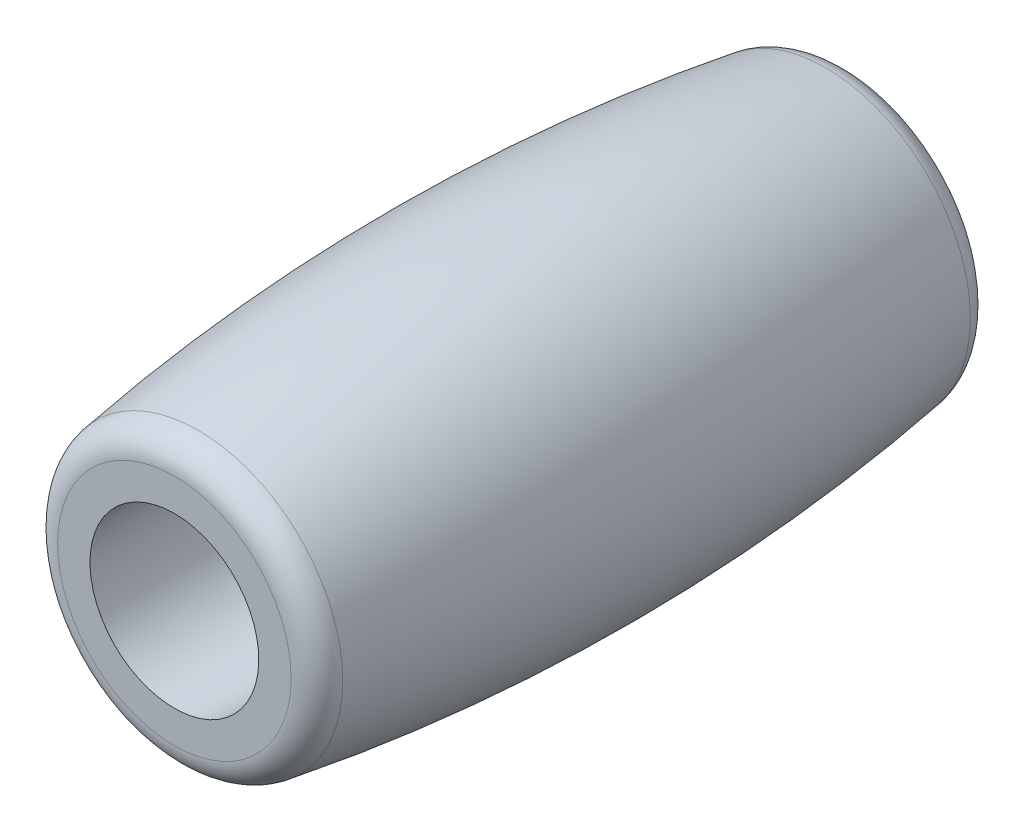
ISO-10303-21;
HEADER;
FILE_DESCRIPTION(('STEP AP214'),'2;1');
FILE_NAME('part.step','',(''),(''),'','','');
FILE_SCHEMA(('AUTOMOTIVE_DESIGN { 1 0 10303 214 1 1 1 1 }'));
ENDSEC;
DATA;
#1=APPLICATION_CONTEXT('core data for automotive mechanical design processes');
#2=APPLICATION_PROTOCOL_DEFINITION('international standard','automotive_design',2000,#1);
#3=PRODUCT_CONTEXT('',#1,'mechanical');
#4=PRODUCT('Part','Part','',(#3));
#5=PRODUCT_RELATED_PRODUCT_CATEGORY('part','',(#4));
#6=PRODUCT_DEFINITION_FORMATION('','',#4);
#7=PRODUCT_DEFINITION_CONTEXT('part definition',#1,'design');
#8=PRODUCT_DEFINITION('design','',#6,#7);
#9=PRODUCT_DEFINITION_SHAPE('','',#8);
#10=(LENGTH_UNIT() NAMED_UNIT(*) SI_UNIT(.MILLI.,.METRE.));
#11=(NAMED_UNIT(*) PLANE_ANGLE_UNIT() SI_UNIT($,.RADIAN.));
#12=(NAMED_UNIT(*) SI_UNIT($,.STERADIAN.) SOLID_ANGLE_UNIT());
#13=UNCERTAINTY_MEASURE_WITH_UNIT(LENGTH_MEASURE(1.E-05),#10,'distance_accuracy_value','');
#14=(GEOMETRIC_REPRESENTATION_CONTEXT(3) GLOBAL_UNCERTAINTY_ASSIGNED_CONTEXT((#13)) GLOBAL_UNIT_ASSIGNED_CONTEXT((#10,
#11,#12)) REPRESENTATION_CONTEXT('',''));
#15=CARTESIAN_POINT('',(0.,0.,0.));
#16=DIRECTION('',(0.,0.,1.));
#17=DIRECTION('',(1.,0.,0.));
#18=AXIS2_PLACEMENT_3D('',#15,#16,#17);
#19=CARTESIAN_POINT('',(0.,0.,-38.1));
#20=DIRECTION('',(0.,0.,-1.));
#21=DIRECTION('',(0.,1.,0.));
#22=AXIS2_PLACEMENT_3D('',#19,#20,#21);
#23=CYLINDRICAL_SURFACE('',#22,4.7625);
#24=CARTESIAN_POINT('',(0.,0.,0.));
#25=DIRECTION('',(0.,0.,-1.));
#26=DIRECTION('',(0.,1.,0.));
#27=AXIS2_PLACEMENT_3D('',#24,#25,#26);
#28=CIRCLE('',#27,4.7625);
#29=CARTESIAN_POINT('',(0.,4.76249999999999,0.));
#30=VERTEX_POINT('',#29);
#31=EDGE_CURVE('E55',#30,#30,#28,.T.);
#32=ORIENTED_EDGE('',*,*,#31,.F.);
#33=EDGE_LOOP('',(#32));
#34=FACE_BOUND('',#33,.T.);
#35=CARTESIAN_POINT('',(0.,0.,-38.1));
#36=DIRECTION('',(0.,0.,-1.));
#37=DIRECTION('',(0.,1.,0.));
#38=AXIS2_PLACEMENT_3D('',#35,#36,#37);
#39=CIRCLE('',#38,4.7625);
#40=CARTESIAN_POINT('',(0.,4.76249999999999,-38.1));
#41=VERTEX_POINT('',#40);
#42=EDGE_CURVE('E54',#41,#41,#39,.F.);
#43=ORIENTED_EDGE('',*,*,#42,.F.);
#44=EDGE_LOOP('',(#43));
#45=FACE_BOUND('',#44,.T.);
#46=ADVANCED_FACE('F17',(#34,#45),#23,.F.);
#47=CARTESIAN_POINT('',(7.9375,0.,0.));
#48=DIRECTION('',(0.,0.,1.));
#49=DIRECTION('',(0.,-1.,0.));
#50=AXIS2_PLACEMENT_3D('',#47,#48,#49);
#51=PLANE('',#50);
#52=CARTESIAN_POINT('',(0.,0.,0.));
#53=DIRECTION('',(0.,0.,-1.));
#54=DIRECTION('',(-1.,0.,0.));
#55=AXIS2_PLACEMENT_3D('',#52,#53,#54);
#56=CIRCLE('',#55,6.58618695246996);
#57=CARTESIAN_POINT('',(-6.58618695246998,0.,0.));
#58=VERTEX_POINT('',#57);
#59=CARTESIAN_POINT('',(6.58618695246997,0.,0.));
#60=VERTEX_POINT('',#59);
#61=EDGE_CURVE('E46',#58,#60,#56,.T.);
#62=ORIENTED_EDGE('',*,*,#61,.F.);
#63=CARTESIAN_POINT('',(0.,0.,0.));
#64=DIRECTION('',(0.,0.,-1.));
#65=DIRECTION('',(1.,0.,0.));
#66=AXIS2_PLACEMENT_3D('',#63,#64,#65);
#67=CIRCLE('',#66,6.58618695246998);
#68=EDGE_CURVE('E52',#60,#58,#67,.T.);
#69=ORIENTED_EDGE('',*,*,#68,.F.);
#70=EDGE_LOOP('',(#62,#69));
#71=FACE_BOUND('',#70,.T.);
#72=ORIENTED_EDGE('',*,*,#31,.T.);
#73=EDGE_LOOP('',(#72));
#74=FACE_BOUND('',#73,.T.);
#75=ADVANCED_FACE('F50',(#71,#74),#51,.T.);
#76=CARTESIAN_POINT('',(1.5875,0.,-38.1));
#77=DIRECTION('',(0.,0.,-1.));
#78=DIRECTION('',(-1.,0.,0.));
#79=AXIS2_PLACEMENT_3D('',#76,#77,#78);
#80=PLANE('',#79);
#81=CARTESIAN_POINT('',(0.,0.,-38.1));
#82=DIRECTION('',(0.,0.,1.));
#83=DIRECTION('',(1.,0.,0.));
#84=AXIS2_PLACEMENT_3D('',#81,#82,#83);
#85=CIRCLE('',#84,6.58618695246996);
#86=CARTESIAN_POINT('',(-6.58618695246996,0.,-38.1));
#87=VERTEX_POINT('',#86);
#88=CARTESIAN_POINT('',(6.58618695246993,0.,-38.1));
#89=VERTEX_POINT('',#88);
#90=EDGE_CURVE('E37',#87,#89,#85,.F.);
#91=ORIENTED_EDGE('',*,*,#90,.T.);
#92=CARTESIAN_POINT('',(0.,0.,-38.1));
#93=DIRECTION('',(0.,0.,1.));
#94=DIRECTION('',(-1.,0.,0.));
#95=AXIS2_PLACEMENT_3D('',#92,#93,#94);
#96=CIRCLE('',#95,6.58618695246994);
#97=EDGE_CURVE('E59',#87,#89,#96,.T.);
#98=ORIENTED_EDGE('',*,*,#97,.F.);
#99=EDGE_LOOP('',(#91,#98));
#100=FACE_BOUND('',#99,.T.);
#101=ORIENTED_EDGE('',*,*,#42,.T.);
#102=EDGE_LOOP('',(#101));
#103=FACE_BOUND('',#102,.T.);
#104=ADVANCED_FACE('F80',(#100,#103),#80,.T.);
#105=CARTESIAN_POINT('',(0.,0.,-1.5875));
#106=DIRECTION('',(0.,0.,1.));
#107=DIRECTION('',(1.,0.,0.));
#108=AXIS2_PLACEMENT_3D('',#105,#106,#107);
#109=TOROIDAL_SURFACE('',#108,6.58618695246997,1.5875);
#110=CARTESIAN_POINT('',(0.,0.,-1.34326923076927));
#111=DIRECTION('',(0.,0.,-1.));
#112=DIRECTION('',(-1.,0.,0.));
#113=AXIS2_PLACEMENT_3D('',#110,#111,#112);
#114=CIRCLE('',#113,8.15478746928767);
#115=CARTESIAN_POINT('',(-8.15478746928767,0.,-1.34326923076926));
#116=VERTEX_POINT('',#115);
#117=EDGE_CURVE('E29',#116,#116,#114,.T.);
#118=ORIENTED_EDGE('',*,*,#117,.F.);
#119=EDGE_LOOP('',(#118));
#120=FACE_BOUND('',#119,.T.);
#121=ORIENTED_EDGE('',*,*,#68,.T.);
#122=ORIENTED_EDGE('',*,*,#61,.T.);
#123=EDGE_LOOP('',(#121,#122));
#124=FACE_BOUND('',#123,.T.);
#125=ADVANCED_FACE('F58',(#120,#124),#109,.T.);
#126=CARTESIAN_POINT('',(0.,0.,-36.5125));
#127=DIRECTION('',(0.,0.,-1.));
#128=DIRECTION('',(-1.,0.,0.));
#129=AXIS2_PLACEMENT_3D('',#126,#127,#128);
#130=TOROIDAL_SURFACE('',#129,6.58618695246994,1.5875);
#131=CARTESIAN_POINT('',(0.,0.,-36.7567307692307));
#132=DIRECTION('',(0.,0.,1.));
#133=DIRECTION('',(1.,0.,0.));
#134=AXIS2_PLACEMENT_3D('',#131,#132,#133);
#135=CIRCLE('',#134,8.15478746928767);
#136=CARTESIAN_POINT('',(8.15478746928767,0.,-36.7567307692307));
#137=VERTEX_POINT('',#136);
#138=EDGE_CURVE('E11',#137,#137,#135,.T.);
#139=ORIENTED_EDGE('',*,*,#138,.F.);
#140=EDGE_LOOP('',(#139));
#141=FACE_BOUND('',#140,.T.);
#142=ORIENTED_EDGE('',*,*,#97,.T.);
#143=ORIENTED_EDGE('',*,*,#90,.F.);
#144=EDGE_LOOP('',(#142,#143));
#145=FACE_BOUND('',#144,.T.);
#146=ADVANCED_FACE('F79',(#141,#145),#130,.T.);
#147=CARTESIAN_POINT('',(0.,0.,-19.0499999999999));
#148=DIRECTION('',(0.,0.,-1.));
#149=DIRECTION('',(-1.,0.,0.));
#150=AXIS2_PLACEMENT_3D('',#147,#148,#149);
#151=DEGENERATE_TOROIDAL_SURFACE('',#150,105.56875,115.09375,.F.);
#152=ORIENTED_EDGE('',*,*,#117,.T.);
#153=EDGE_LOOP('',(#152));
#154=FACE_BOUND('',#153,.T.);
#155=ORIENTED_EDGE('',*,*,#138,.T.);
#156=EDGE_LOOP('',(#155));
#157=FACE_BOUND('',#156,.T.);
#158=ADVANCED_FACE('F19',(#154,#157),#151,.F.);
#159=CLOSED_SHELL('',(#46,#75,#104,#125,#146,#158));
#160=MANIFOLD_SOLID_BREP('B1',#159);
#161=ADVANCED_BREP_SHAPE_REPRESENTATION('',(#18,#160),#14);
#162=SHAPE_DEFINITION_REPRESENTATION(#9,#161);
ENDSEC;
END-ISO-10303-21;
